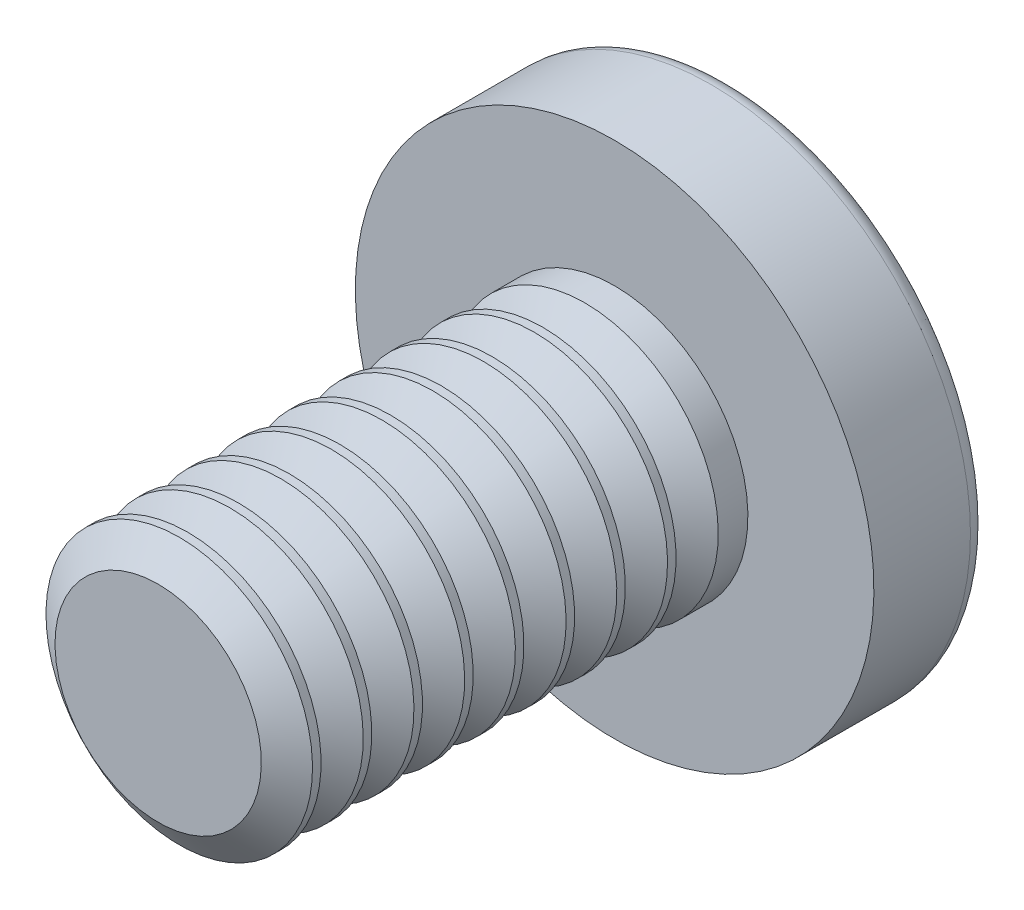
ISO-10303-21;
HEADER;
FILE_DESCRIPTION(('STEP AP214'),'2;1');
FILE_NAME('part.step','',(''),(''),'','','');
FILE_SCHEMA(('AUTOMOTIVE_DESIGN { 1 0 10303 214 1 1 1 1 }'));
ENDSEC;
DATA;
#1=APPLICATION_CONTEXT('core data for automotive mechanical design processes');
#2=APPLICATION_PROTOCOL_DEFINITION('international standard','automotive_design',2000,#1);
#3=PRODUCT_CONTEXT('',#1,'mechanical');
#4=PRODUCT('Part','Part','',(#3));
#5=PRODUCT_RELATED_PRODUCT_CATEGORY('part','',(#4));
#6=PRODUCT_DEFINITION_FORMATION('','',#4);
#7=PRODUCT_DEFINITION_CONTEXT('part definition',#1,'design');
#8=PRODUCT_DEFINITION('design','',#6,#7);
#9=PRODUCT_DEFINITION_SHAPE('','',#8);
#10=(LENGTH_UNIT() NAMED_UNIT(*) SI_UNIT(.MILLI.,.METRE.));
#11=(NAMED_UNIT(*) PLANE_ANGLE_UNIT() SI_UNIT($,.RADIAN.));
#12=(NAMED_UNIT(*) SI_UNIT($,.STERADIAN.) SOLID_ANGLE_UNIT());
#13=UNCERTAINTY_MEASURE_WITH_UNIT(LENGTH_MEASURE(1.E-05),#10,'distance_accuracy_value','');
#14=(GEOMETRIC_REPRESENTATION_CONTEXT(3) GLOBAL_UNCERTAINTY_ASSIGNED_CONTEXT((#13)) GLOBAL_UNIT_ASSIGNED_CONTEXT((#10,
#11,#12)) REPRESENTATION_CONTEXT('',''));
#15=CARTESIAN_POINT('',(0.,0.,0.));
#16=DIRECTION('',(0.,0.,1.));
#17=DIRECTION('',(1.,0.,0.));
#18=AXIS2_PLACEMENT_3D('',#15,#16,#17);
#19=CARTESIAN_POINT('',(-24.5432148881919,23.9214664243212,-2.10712260314341));
#20=DIRECTION('',(0.,0.,1.));
#21=DIRECTION('',(0.,-1.,0.));
#22=AXIS2_PLACEMENT_3D('',#19,#20,#21);
#23=PLANE('',#22);
#24=CARTESIAN_POINT('',(-24.5432148881919,22.9943664243215,-2.10712260314409));
#25=DIRECTION('',(0.,0.,-1.));
#26=DIRECTION('',(0.,1.,0.));
#27=AXIS2_PLACEMENT_3D('',#24,#25,#26);
#28=CIRCLE('',#27,0.717549999990293);
#29=CARTESIAN_POINT('',(-24.5432148881919,23.7119164243117,-2.10712260314409));
#30=VERTEX_POINT('',#29);
#31=EDGE_CURVE('E20',#30,#30,#28,.T.);
#32=ORIENTED_EDGE('',*,*,#31,.F.);
#33=EDGE_LOOP('',(#32));
#34=FACE_BOUND('',#33,.T.);
#35=ADVANCED_FACE('F17',(#34),#23,.T.);
#36=CARTESIAN_POINT('',(-24.5432148881919,22.9943664243215,-2.25385109274612));
#37=DIRECTION('',(0.,0.,-1.));
#38=DIRECTION('',(0.,1.,0.));
#39=AXIS2_PLACEMENT_3D('',#36,#37,#38);
#40=CONICAL_SURFACE('',#39,0.927099999906644,0.959931088504795);
#41=CARTESIAN_POINT('',(-24.5432148881919,22.9943664243214,-2.25385109277525));
#42=DIRECTION('',(0.,0.,-1.));
#43=DIRECTION('',(0.,1.,0.));
#44=AXIS2_PLACEMENT_3D('',#41,#42,#43);
#45=CIRCLE('',#44,0.9271);
#46=CARTESIAN_POINT('',(-24.5432148881919,23.9214664243214,-2.25385109277525));
#47=VERTEX_POINT('',#46);
#48=EDGE_CURVE('E197',#47,#47,#45,.T.);
#49=ORIENTED_EDGE('',*,*,#48,.F.);
#50=EDGE_LOOP('',(#49));
#51=FACE_BOUND('',#50,.T.);
#52=ORIENTED_EDGE('',*,*,#31,.T.);
#53=EDGE_LOOP('',(#52));
#54=FACE_BOUND('',#53,.T.);
#55=ADVANCED_FACE('F710',(#51,#54),#40,.T.);
#56=CARTESIAN_POINT('',(-24.5432148881919,22.9943664243214,-32.0283226031433));
#57=DIRECTION('',(0.,0.,-1.));
#58=DIRECTION('',(0.,1.,0.));
#59=AXIS2_PLACEMENT_3D('',#56,#57,#58);
#60=CYLINDRICAL_SURFACE('',#59,0.9271);
#61=CARTESIAN_POINT('',(-24.543214888192,22.9943664243215,-2.31313661350896));
#62=DIRECTION('',(0.,0.,1.));
#63=DIRECTION('',(0.,1.,0.));
#64=AXIS2_PLACEMENT_3D('',#61,#62,#63);
#65=CIRCLE('',#64,0.927099999948059);
#66=CARTESIAN_POINT('',(-24.543214888192,23.9214664242695,-2.31313661350896));
#67=VERTEX_POINT('',#66);
#68=EDGE_CURVE('E194',#67,#67,#65,.F.);
#69=ORIENTED_EDGE('',*,*,#68,.F.);
#70=EDGE_LOOP('',(#69));
#71=FACE_BOUND('',#70,.T.);
#72=ORIENTED_EDGE('',*,*,#48,.T.);
#73=EDGE_LOOP('',(#72));
#74=FACE_BOUND('',#73,.T.);
#75=ADVANCED_FACE('F700',(#71,#74),#60,.T.);
#76=CARTESIAN_POINT('',(-24.543214888192,22.9943664243214,-2.31313661350896));
#77=DIRECTION('',(0.,0.,1.));
#78=DIRECTION('',(0.,-1.,0.));
#79=AXIS2_PLACEMENT_3D('',#76,#77,#78);
#80=CONICAL_SURFACE('',#79,0.927099999948062,0.959931088632246);
#81=CARTESIAN_POINT('',(-24.543214888192,22.9943664243215,-2.45986510316243));
#82=DIRECTION('',(0.,0.,-1.));
#83=DIRECTION('',(0.,-1.,0.));
#84=AXIS2_PLACEMENT_3D('',#81,#82,#83);
#85=CIRCLE('',#84,0.717549999998009);
#86=CARTESIAN_POINT('',(-24.543214888192,22.2768164243234,-2.45986510316243));
#87=VERTEX_POINT('',#86);
#88=EDGE_CURVE('E191',#87,#87,#85,.T.);
#89=ORIENTED_EDGE('',*,*,#88,.F.);
#90=EDGE_LOOP('',(#89));
#91=FACE_BOUND('',#90,.T.);
#92=ORIENTED_EDGE('',*,*,#68,.T.);
#93=EDGE_LOOP('',(#92));
#94=FACE_BOUND('',#93,.T.);
#95=ADVANCED_FACE('F690',(#91,#94),#80,.T.);
#96=CARTESIAN_POINT('',(-24.543214888192,22.9943664243215,-2.60659359275905));
#97=DIRECTION('',(0.,0.,-1.));
#98=DIRECTION('',(0.,1.,0.));
#99=AXIS2_PLACEMENT_3D('',#96,#97,#98);
#100=CONICAL_SURFACE('',#99,0.927099999906644,0.959931088504795);
#101=ORIENTED_EDGE('',*,*,#88,.T.);
#102=EDGE_LOOP('',(#101));
#103=FACE_BOUND('',#102,.T.);
#104=CARTESIAN_POINT('',(-24.5432148881919,22.9943664243214,-2.60659359277526));
#105=DIRECTION('',(0.,0.,-1.));
#106=DIRECTION('',(0.,1.,0.));
#107=AXIS2_PLACEMENT_3D('',#104,#105,#106);
#108=CIRCLE('',#107,0.9271);
#109=CARTESIAN_POINT('',(-24.5432148881919,23.9214664243214,-2.60659359277526));
#110=VERTEX_POINT('',#109);
#111=EDGE_CURVE('E188',#110,#110,#108,.T.);
#112=ORIENTED_EDGE('',*,*,#111,.F.);
#113=EDGE_LOOP('',(#112));
#114=FACE_BOUND('',#113,.T.);
#115=ADVANCED_FACE('F680',(#103,#114),#100,.T.);
#116=CARTESIAN_POINT('',(-24.5432148881919,22.9943664243214,-32.0283226031433));
#117=DIRECTION('',(0.,0.,-1.));
#118=DIRECTION('',(0.,1.,0.));
#119=AXIS2_PLACEMENT_3D('',#116,#117,#118);
#120=CYLINDRICAL_SURFACE('',#119,0.9271);
#121=ORIENTED_EDGE('',*,*,#111,.T.);
#122=EDGE_LOOP('',(#121));
#123=FACE_BOUND('',#122,.T.);
#124=CARTESIAN_POINT('',(-24.5432148881919,22.9943664243214,-2.6658791135219));
#125=DIRECTION('',(0.,0.,1.));
#126=DIRECTION('',(0.,1.,0.));
#127=AXIS2_PLACEMENT_3D('',#124,#125,#126);
#128=CIRCLE('',#127,0.927099999948111);
#129=CARTESIAN_POINT('',(-24.5432148881919,23.9214664242695,-2.6658791135219));
#130=VERTEX_POINT('',#129);
#131=EDGE_CURVE('E185',#130,#130,#128,.F.);
#132=ORIENTED_EDGE('',*,*,#131,.F.);
#133=EDGE_LOOP('',(#132));
#134=FACE_BOUND('',#133,.T.);
#135=ADVANCED_FACE('F670',(#123,#134),#120,.T.);
#136=CARTESIAN_POINT('',(-24.5432148881919,22.9943664243214,-2.6658791135219));
#137=DIRECTION('',(0.,0.,1.));
#138=DIRECTION('',(0.,-1.,0.));
#139=AXIS2_PLACEMENT_3D('',#136,#137,#138);
#140=CONICAL_SURFACE('',#139,0.927099999948111,0.959931088632246);
#141=ORIENTED_EDGE('',*,*,#131,.T.);
#142=EDGE_LOOP('',(#141));
#143=FACE_BOUND('',#142,.T.);
#144=CARTESIAN_POINT('',(-24.5432148881919,22.9943664243214,-2.81260760311852));
#145=DIRECTION('',(0.,0.,-1.));
#146=DIRECTION('',(0.,-1.,0.));
#147=AXIS2_PLACEMENT_3D('',#144,#145,#146);
#148=CIRCLE('',#147,0.717549999997957);
#149=CARTESIAN_POINT('',(-24.5432148881919,22.2768164243234,-2.81260760311852));
#150=VERTEX_POINT('',#149);
#151=EDGE_CURVE('E182',#150,#150,#148,.T.);
#152=ORIENTED_EDGE('',*,*,#151,.F.);
#153=EDGE_LOOP('',(#152));
#154=FACE_BOUND('',#153,.T.);
#155=ADVANCED_FACE('F660',(#143,#154),#140,.T.);
#156=CARTESIAN_POINT('',(-24.5432148881919,22.9943664243214,-2.95933609271515));
#157=DIRECTION('',(0.,0.,-1.));
#158=DIRECTION('',(0.,1.,0.));
#159=AXIS2_PLACEMENT_3D('',#156,#157,#158);
#160=CONICAL_SURFACE('',#159,0.927099999906589,0.959931088504793);
#161=CARTESIAN_POINT('',(-24.5432148881919,22.9943664243214,-2.95933609277526));
#162=DIRECTION('',(0.,0.,-1.));
#163=DIRECTION('',(0.,1.,0.));
#164=AXIS2_PLACEMENT_3D('',#161,#162,#163);
#165=CIRCLE('',#164,0.9271);
#166=CARTESIAN_POINT('',(-24.5432148881919,23.9214664243214,-2.95933609277526));
#167=VERTEX_POINT('',#166);
#168=EDGE_CURVE('E179',#167,#167,#165,.T.);
#169=ORIENTED_EDGE('',*,*,#168,.F.);
#170=EDGE_LOOP('',(#169));
#171=FACE_BOUND('',#170,.T.);
#172=ORIENTED_EDGE('',*,*,#151,.T.);
#173=EDGE_LOOP('',(#172));
#174=FACE_BOUND('',#173,.T.);
#175=ADVANCED_FACE('F650',(#171,#174),#160,.T.);
#176=CARTESIAN_POINT('',(-24.5432148881919,22.9943664243214,-32.0283226031433));
#177=DIRECTION('',(0.,0.,-1.));
#178=DIRECTION('',(0.,1.,0.));
#179=AXIS2_PLACEMENT_3D('',#176,#177,#178);
#180=CYLINDRICAL_SURFACE('',#179,0.9271);
#181=CARTESIAN_POINT('',(-24.543214888192,22.9943664243215,-3.01862161353483));
#182=DIRECTION('',(0.,0.,1.));
#183=DIRECTION('',(0.,1.,0.));
#184=AXIS2_PLACEMENT_3D('',#181,#182,#183);
#185=CIRCLE('',#184,0.927099999948059);
#186=CARTESIAN_POINT('',(-24.543214888192,23.9214664242695,-3.01862161353483));
#187=VERTEX_POINT('',#186);
#188=EDGE_CURVE('E176',#187,#187,#185,.F.);
#189=ORIENTED_EDGE('',*,*,#188,.F.);
#190=EDGE_LOOP('',(#189));
#191=FACE_BOUND('',#190,.T.);
#192=ORIENTED_EDGE('',*,*,#168,.T.);
#193=EDGE_LOOP('',(#192));
#194=FACE_BOUND('',#193,.T.);
#195=ADVANCED_FACE('F640',(#191,#194),#180,.T.);
#196=CARTESIAN_POINT('',(-24.543214888192,22.9943664243215,-3.01862161353483));
#197=DIRECTION('',(0.,0.,1.));
#198=DIRECTION('',(0.,-1.,0.));
#199=AXIS2_PLACEMENT_3D('',#196,#197,#198);
#200=CONICAL_SURFACE('',#199,0.927099999948059,0.959931088632246);
#201=CARTESIAN_POINT('',(-24.5432148881919,22.9943664243214,-3.16535010313146));
#202=DIRECTION('',(0.,0.,-1.));
#203=DIRECTION('',(0.,-1.,0.));
#204=AXIS2_PLACEMENT_3D('',#201,#202,#203);
#205=CIRCLE('',#204,0.717549999997957);
#206=CARTESIAN_POINT('',(-24.5432148881919,22.2768164243234,-3.16535010313146));
#207=VERTEX_POINT('',#206);
#208=EDGE_CURVE('E173',#207,#207,#205,.T.);
#209=ORIENTED_EDGE('',*,*,#208,.F.);
#210=EDGE_LOOP('',(#209));
#211=FACE_BOUND('',#210,.T.);
#212=ORIENTED_EDGE('',*,*,#188,.T.);
#213=EDGE_LOOP('',(#212));
#214=FACE_BOUND('',#213,.T.);
#215=ADVANCED_FACE('F630',(#211,#214),#200,.T.);
#216=CARTESIAN_POINT('',(-24.5432148881919,22.9943664243214,-3.31207859272808));
#217=DIRECTION('',(0.,0.,-1.));
#218=DIRECTION('',(0.,1.,0.));
#219=AXIS2_PLACEMENT_3D('',#216,#217,#218);
#220=CONICAL_SURFACE('',#219,0.927099999906589,0.959931088504793);
#221=ORIENTED_EDGE('',*,*,#208,.T.);
#222=EDGE_LOOP('',(#221));
#223=FACE_BOUND('',#222,.T.);
#224=CARTESIAN_POINT('',(-24.5432148881919,22.9943664243214,-3.31207859277526));
#225=DIRECTION('',(0.,0.,-1.));
#226=DIRECTION('',(0.,1.,0.));
#227=AXIS2_PLACEMENT_3D('',#224,#225,#226);
#228=CIRCLE('',#227,0.9271);
#229=CARTESIAN_POINT('',(-24.5432148881919,23.9214664243214,-3.31207859277525));
#230=VERTEX_POINT('',#229);
#231=EDGE_CURVE('E170',#230,#230,#228,.T.);
#232=ORIENTED_EDGE('',*,*,#231,.F.);
#233=EDGE_LOOP('',(#232));
#234=FACE_BOUND('',#233,.T.);
#235=ADVANCED_FACE('F620',(#223,#234),#220,.T.);
#236=CARTESIAN_POINT('',(-24.5432148881919,22.9943664243214,-32.0283226031433));
#237=DIRECTION('',(0.,0.,-1.));
#238=DIRECTION('',(0.,1.,0.));
#239=AXIS2_PLACEMENT_3D('',#236,#237,#238);
#240=CYLINDRICAL_SURFACE('',#239,0.9271);
#241=ORIENTED_EDGE('',*,*,#231,.T.);
#242=EDGE_LOOP('',(#241));
#243=FACE_BOUND('',#242,.T.);
#244=CARTESIAN_POINT('',(-24.5432148881919,22.9943664243214,-3.37136411343408));
#245=DIRECTION('',(0.,0.,1.));
#246=DIRECTION('',(0.,1.,0.));
#247=AXIS2_PLACEMENT_3D('',#244,#245,#246);
#248=CIRCLE('',#247,0.927100000004955);
#249=CARTESIAN_POINT('',(-24.5432148881919,23.9214664243264,-3.37136411343408));
#250=VERTEX_POINT('',#249);
#251=EDGE_CURVE('E167',#250,#250,#248,.F.);
#252=ORIENTED_EDGE('',*,*,#251,.F.);
#253=EDGE_LOOP('',(#252));
#254=FACE_BOUND('',#253,.T.);
#255=ADVANCED_FACE('F610',(#243,#254),#240,.T.);
#256=CARTESIAN_POINT('',(-24.5432148881919,22.9943664243214,-3.37136411343408));
#257=DIRECTION('',(0.,0.,1.));
#258=DIRECTION('',(0.,-1.,0.));
#259=AXIS2_PLACEMENT_3D('',#256,#257,#258);
#260=CONICAL_SURFACE('',#259,0.927100000004955,0.959931088650563);
#261=ORIENTED_EDGE('',*,*,#251,.T.);
#262=EDGE_LOOP('',(#261));
#263=FACE_BOUND('',#262,.T.);
#264=CARTESIAN_POINT('',(-24.543214888192,22.9943664243215,-3.5180926031444));
#265=DIRECTION('',(0.,0.,-1.));
#266=DIRECTION('',(0.,-1.,0.));
#267=AXIS2_PLACEMENT_3D('',#264,#265,#266);
#268=CIRCLE('',#267,0.717549999998009);
#269=CARTESIAN_POINT('',(-24.543214888192,22.2768164243234,-3.5180926031444));
#270=VERTEX_POINT('',#269);
#271=EDGE_CURVE('E164',#270,#270,#268,.T.);
#272=ORIENTED_EDGE('',*,*,#271,.F.);
#273=EDGE_LOOP('',(#272));
#274=FACE_BOUND('',#273,.T.);
#275=ADVANCED_FACE('F600',(#263,#274),#260,.T.);
#276=CARTESIAN_POINT('',(-24.543214888192,22.9943664243214,-3.66482109274102));
#277=DIRECTION('',(0.,0.,-1.));
#278=DIRECTION('',(0.,1.,0.));
#279=AXIS2_PLACEMENT_3D('',#276,#277,#278);
#280=CONICAL_SURFACE('',#279,0.927099999906637,0.959931088504795);
#281=CARTESIAN_POINT('',(-24.5432148881919,22.9943664243214,-3.66482109277525));
#282=DIRECTION('',(0.,0.,-1.));
#283=DIRECTION('',(0.,1.,0.));
#284=AXIS2_PLACEMENT_3D('',#281,#282,#283);
#285=CIRCLE('',#284,0.9271);
#286=CARTESIAN_POINT('',(-24.5432148881919,23.9214664243214,-3.66482109277525));
#287=VERTEX_POINT('',#286);
#288=EDGE_CURVE('E161',#287,#287,#285,.T.);
#289=ORIENTED_EDGE('',*,*,#288,.F.);
#290=EDGE_LOOP('',(#289));
#291=FACE_BOUND('',#290,.T.);
#292=ORIENTED_EDGE('',*,*,#271,.T.);
#293=EDGE_LOOP('',(#292));
#294=FACE_BOUND('',#293,.T.);
#295=ADVANCED_FACE('F590',(#291,#294),#280,.T.);
#296=CARTESIAN_POINT('',(-24.5432148881919,22.9943664243214,-32.0283226031433));
#297=DIRECTION('',(0.,0.,-1.));
#298=DIRECTION('',(0.,1.,0.));
#299=AXIS2_PLACEMENT_3D('',#296,#297,#298);
#300=CYLINDRICAL_SURFACE('',#299,0.9271);
#301=CARTESIAN_POINT('',(-24.543214888192,22.9943664243215,-3.72410661350386));
#302=DIRECTION('',(0.,0.,1.));
#303=DIRECTION('',(0.,1.,0.));
#304=AXIS2_PLACEMENT_3D('',#301,#302,#303);
#305=CIRCLE('',#304,0.927099999948059);
#306=CARTESIAN_POINT('',(-24.543214888192,23.9214664242695,-3.72410661350386));
#307=VERTEX_POINT('',#306);
#308=EDGE_CURVE('E158',#307,#307,#305,.F.);
#309=ORIENTED_EDGE('',*,*,#308,.F.);
#310=EDGE_LOOP('',(#309));
#311=FACE_BOUND('',#310,.T.);
#312=ORIENTED_EDGE('',*,*,#288,.T.);
#313=EDGE_LOOP('',(#312));
#314=FACE_BOUND('',#313,.T.);
#315=ADVANCED_FACE('F580',(#311,#314),#300,.T.);
#316=CARTESIAN_POINT('',(-24.543214888192,22.9943664243215,-3.72410661350386));
#317=DIRECTION('',(0.,0.,1.));
#318=DIRECTION('',(0.,-1.,0.));
#319=AXIS2_PLACEMENT_3D('',#316,#317,#318);
#320=CONICAL_SURFACE('',#319,0.927099999948059,0.959931088632247);
#321=CARTESIAN_POINT('',(-24.543214888192,22.9943664243215,-3.87083510315733));
#322=DIRECTION('',(0.,0.,-1.));
#323=DIRECTION('',(0.,-1.,0.));
#324=AXIS2_PLACEMENT_3D('',#321,#322,#323);
#325=CIRCLE('',#324,0.717549999998009);
#326=CARTESIAN_POINT('',(-24.543214888192,22.2768164243234,-3.87083510315733));
#327=VERTEX_POINT('',#326);
#328=EDGE_CURVE('E155',#327,#327,#325,.T.);
#329=ORIENTED_EDGE('',*,*,#328,.F.);
#330=EDGE_LOOP('',(#329));
#331=FACE_BOUND('',#330,.T.);
#332=ORIENTED_EDGE('',*,*,#308,.T.);
#333=EDGE_LOOP('',(#332));
#334=FACE_BOUND('',#333,.T.);
#335=ADVANCED_FACE('F570',(#331,#334),#320,.T.);
#336=CARTESIAN_POINT('',(-24.543214888192,22.9943664243214,-4.01756359275396));
#337=DIRECTION('',(0.,0.,-1.));
#338=DIRECTION('',(0.,1.,0.));
#339=AXIS2_PLACEMENT_3D('',#336,#337,#338);
#340=CONICAL_SURFACE('',#339,0.927099999906637,0.959931088504793);
#341=ORIENTED_EDGE('',*,*,#328,.T.);
#342=EDGE_LOOP('',(#341));
#343=FACE_BOUND('',#342,.T.);
#344=CARTESIAN_POINT('',(-24.5432148881919,22.9943664243214,-4.01756359277525));
#345=DIRECTION('',(0.,0.,-1.));
#346=DIRECTION('',(0.,1.,0.));
#347=AXIS2_PLACEMENT_3D('',#344,#345,#346);
#348=CIRCLE('',#347,0.9271);
#349=CARTESIAN_POINT('',(-24.5432148881919,23.9214664243214,-4.01756359277525));
#350=VERTEX_POINT('',#349);
#351=EDGE_CURVE('E152',#350,#350,#348,.T.);
#352=ORIENTED_EDGE('',*,*,#351,.F.);
#353=EDGE_LOOP('',(#352));
#354=FACE_BOUND('',#353,.T.);
#355=ADVANCED_FACE('F560',(#343,#354),#340,.T.);
#356=CARTESIAN_POINT('',(-24.5432148881919,22.9943664243214,-32.0283226031433));
#357=DIRECTION('',(0.,0.,-1.));
#358=DIRECTION('',(0.,1.,0.));
#359=AXIS2_PLACEMENT_3D('',#356,#357,#358);
#360=CYLINDRICAL_SURFACE('',#359,0.9271);
#361=ORIENTED_EDGE('',*,*,#351,.T.);
#362=EDGE_LOOP('',(#361));
#363=FACE_BOUND('',#362,.T.);
#364=CARTESIAN_POINT('',(-24.543214888192,22.9943664243215,-4.07684911345996));
#365=DIRECTION('',(0.,0.,1.));
#366=DIRECTION('',(0.,1.,0.));
#367=AXIS2_PLACEMENT_3D('',#364,#365,#366);
#368=CIRCLE('',#367,0.927100000004902);
#369=CARTESIAN_POINT('',(-24.543214888192,23.9214664243264,-4.07684911345996));
#370=VERTEX_POINT('',#369);
#371=EDGE_CURVE('E149',#370,#370,#368,.F.);
#372=ORIENTED_EDGE('',*,*,#371,.F.);
#373=EDGE_LOOP('',(#372));
#374=FACE_BOUND('',#373,.T.);
#375=ADVANCED_FACE('F550',(#363,#374),#360,.T.);
#376=CARTESIAN_POINT('',(-24.543214888192,22.9943664243215,-4.07684911345996));
#377=DIRECTION('',(0.,0.,1.));
#378=DIRECTION('',(0.,-1.,0.));
#379=AXIS2_PLACEMENT_3D('',#376,#377,#378);
#380=CONICAL_SURFACE('',#379,0.927100000004902,0.959931088650561);
#381=ORIENTED_EDGE('',*,*,#371,.T.);
#382=EDGE_LOOP('',(#381));
#383=FACE_BOUND('',#382,.T.);
#384=CARTESIAN_POINT('',(-24.5432148881919,22.9943664243214,-4.22357760317027));
#385=DIRECTION('',(0.,0.,-1.));
#386=DIRECTION('',(0.,-1.,0.));
#387=AXIS2_PLACEMENT_3D('',#384,#385,#386);
#388=CIRCLE('',#387,0.717549999997957);
#389=CARTESIAN_POINT('',(-24.5432148881919,22.2768164243234,-4.22357760317027));
#390=VERTEX_POINT('',#389);
#391=EDGE_CURVE('E146',#390,#390,#388,.T.);
#392=ORIENTED_EDGE('',*,*,#391,.F.);
#393=EDGE_LOOP('',(#392));
#394=FACE_BOUND('',#393,.T.);
#395=ADVANCED_FACE('F540',(#383,#394),#380,.T.);
#396=CARTESIAN_POINT('',(-24.5432148881919,22.9943664243214,-4.37030609271005));
#397=DIRECTION('',(0.,0.,-1.));
#398=DIRECTION('',(0.,1.,0.));
#399=AXIS2_PLACEMENT_3D('',#396,#397,#398);
#400=CONICAL_SURFACE('',#399,0.927099999792902,0.959931088523111);
#401=CARTESIAN_POINT('',(-24.5432148881919,22.9943664243214,-4.37030609277525));
#402=DIRECTION('',(0.,0.,-1.));
#403=DIRECTION('',(0.,1.,0.));
#404=AXIS2_PLACEMENT_3D('',#401,#402,#403);
#405=CIRCLE('',#404,0.9271);
#406=CARTESIAN_POINT('',(-24.5432148881919,23.9214664243214,-4.37030609277525));
#407=VERTEX_POINT('',#406);
#408=EDGE_CURVE('E139',#407,#407,#405,.T.);
#409=ORIENTED_EDGE('',*,*,#408,.F.);
#410=EDGE_LOOP('',(#409));
#411=FACE_BOUND('',#410,.T.);
#412=ORIENTED_EDGE('',*,*,#391,.T.);
#413=EDGE_LOOP('',(#412));
#414=FACE_BOUND('',#413,.T.);
#415=ADVANCED_FACE('F530',(#411,#414),#400,.T.);
#416=CARTESIAN_POINT('',(-24.5432148881919,22.9943664243214,-32.0283226031433));
#417=DIRECTION('',(0.,0.,-1.));
#418=DIRECTION('',(0.,1.,0.));
#419=AXIS2_PLACEMENT_3D('',#416,#417,#418);
#420=CYLINDRICAL_SURFACE('',#419,0.9271);
#421=CARTESIAN_POINT('',(-24.5432148881919,22.9943664243214,-4.42959161347289));
#422=DIRECTION('',(0.,0.,1.));
#423=DIRECTION('',(0.,1.,0.));
#424=AXIS2_PLACEMENT_3D('',#421,#422,#423);
#425=CIRCLE('',#424,0.927100000004955);
#426=CARTESIAN_POINT('',(-24.5432148881919,23.9214664243264,-4.42959161347289));
#427=VERTEX_POINT('',#426);
#428=EDGE_CURVE('E136',#427,#427,#425,.F.);
#429=ORIENTED_EDGE('',*,*,#428,.F.);
#430=EDGE_LOOP('',(#429));
#431=FACE_BOUND('',#430,.T.);
#432=ORIENTED_EDGE('',*,*,#408,.T.);
#433=EDGE_LOOP('',(#432));
#434=FACE_BOUND('',#433,.T.);
#435=ADVANCED_FACE('F307',(#431,#434),#420,.T.);
#436=CARTESIAN_POINT('',(-24.5432148881919,22.9943664243214,-4.42959161347289));
#437=DIRECTION('',(0.,0.,1.));
#438=DIRECTION('',(0.,-1.,0.));
#439=AXIS2_PLACEMENT_3D('',#436,#437,#438);
#440=CONICAL_SURFACE('',#439,0.927100000004955,0.959931088650561);
#441=CARTESIAN_POINT('',(-24.543214888192,22.9943664243215,-4.57632010312636));
#442=DIRECTION('',(0.,0.,-1.));
#443=DIRECTION('',(0.,-1.,0.));
#444=AXIS2_PLACEMENT_3D('',#441,#442,#443);
#445=CIRCLE('',#444,0.717549999998009);
#446=CARTESIAN_POINT('',(-24.543214888192,22.2768164243234,-4.57632010312636));
#447=VERTEX_POINT('',#446);
#448=EDGE_CURVE('E133',#447,#447,#445,.T.);
#449=ORIENTED_EDGE('',*,*,#448,.F.);
#450=EDGE_LOOP('',(#449));
#451=FACE_BOUND('',#450,.T.);
#452=ORIENTED_EDGE('',*,*,#428,.T.);
#453=EDGE_LOOP('',(#452));
#454=FACE_BOUND('',#453,.T.);
#455=ADVANCED_FACE('F298',(#451,#454),#440,.T.);
#456=CARTESIAN_POINT('',(-24.543214888192,22.9943664243215,-4.72304859266614));
#457=DIRECTION('',(0.,0.,-1.));
#458=DIRECTION('',(0.,1.,0.));
#459=AXIS2_PLACEMENT_3D('',#456,#457,#458);
#460=CONICAL_SURFACE('',#459,0.927099999792957,0.959931088523109);
#461=ORIENTED_EDGE('',*,*,#448,.T.);
#462=EDGE_LOOP('',(#461));
#463=FACE_BOUND('',#462,.T.);
#464=CARTESIAN_POINT('',(-24.5432148881919,22.9943664243214,-4.72304859277526));
#465=DIRECTION('',(0.,0.,-1.));
#466=DIRECTION('',(0.,1.,0.));
#467=AXIS2_PLACEMENT_3D('',#464,#465,#466);
#468=CIRCLE('',#467,0.9271);
#469=CARTESIAN_POINT('',(-24.5432148881919,23.9214664243214,-4.72304859277526));
#470=VERTEX_POINT('',#469);
#471=EDGE_CURVE('E104',#470,#470,#468,.T.);
#472=ORIENTED_EDGE('',*,*,#471,.F.);
#473=EDGE_LOOP('',(#472));
#474=FACE_BOUND('',#473,.T.);
#475=ADVANCED_FACE('F296',(#463,#474),#460,.T.);
#476=CARTESIAN_POINT('',(-24.390814888192,23.1467664243214,-5.45992260314341));
#477=DIRECTION('',(0.,0.,-1.));
#478=DIRECTION('',(0.,1.,0.));
#479=AXIS2_PLACEMENT_3D('',#476,#477,#478);
#480=PLANE('',#479);
#481=DIRECTION('',(0.,1.,0.));
#482=VECTOR('',#481,1.);
#483=CARTESIAN_POINT('',(-24.695614888192,22.8419664243214,-5.45992260314341));
#484=LINE('',#483,#482);
#485=CARTESIAN_POINT('',(-24.695614888192,22.8419664243214,-5.45992260314341));
#486=VERTEX_POINT('',#485);
#487=CARTESIAN_POINT('',(-24.695614888192,23.1467664243215,-5.45992260314341));
#488=VERTEX_POINT('',#487);
#489=EDGE_CURVE('E81',#486,#488,#484,.T.);
#490=ORIENTED_EDGE('',*,*,#489,.T.);
#491=DIRECTION('',(1.,0.,0.));
#492=VECTOR('',#491,1.);
#493=CARTESIAN_POINT('',(-24.695614888192,23.1467664243215,-5.45992260314341));
#494=LINE('',#493,#492);
#495=CARTESIAN_POINT('',(-24.3908148881919,23.1467664243214,-5.45992260314341));
#496=VERTEX_POINT('',#495);
#497=EDGE_CURVE('E125',#488,#496,#494,.T.);
#498=ORIENTED_EDGE('',*,*,#497,.T.);
#499=DIRECTION('',(0.,1.,0.));
#500=VECTOR('',#499,1.);
#501=CARTESIAN_POINT('',(-24.390814888192,23.1467664243214,-5.45992260314341));
#502=LINE('',#501,#500);
#503=CARTESIAN_POINT('',(-24.3908148881919,22.8419664243214,-5.45992260314341));
#504=VERTEX_POINT('',#503);
#505=EDGE_CURVE('E91',#496,#504,#502,.F.);
#506=ORIENTED_EDGE('',*,*,#505,.T.);
#507=DIRECTION('',(1.,0.,0.));
#508=VECTOR('',#507,1.);
#509=CARTESIAN_POINT('',(-24.3908148881919,22.8419664243214,-5.45992260314341));
#510=LINE('',#509,#508);
#511=EDGE_CURVE('E110',#504,#486,#510,.F.);
#512=ORIENTED_EDGE('',*,*,#511,.T.);
#513=EDGE_LOOP('',(#490,#498,#506,#512));
#514=FACE_BOUND('',#513,.T.);
#515=ADVANCED_FACE('F124',(#514),#480,.T.);
#516=CARTESIAN_POINT('',(-24.5432148881919,22.9943664243214,-32.0283226031433));
#517=DIRECTION('',(0.,0.,-1.));
#518=DIRECTION('',(0.,1.,0.));
#519=AXIS2_PLACEMENT_3D('',#516,#517,#518);
#520=CYLINDRICAL_SURFACE('',#519,0.9271);
#521=ORIENTED_EDGE('',*,*,#471,.T.);
#522=EDGE_LOOP('',(#521));
#523=FACE_BOUND('',#522,.T.);
#524=CARTESIAN_POINT('',(-24.5432148881919,22.9943664243214,-4.78233411342899));
#525=DIRECTION('',(0.,0.,1.));
#526=DIRECTION('',(0.,1.,0.));
#527=AXIS2_PLACEMENT_3D('',#524,#525,#526);
#528=CIRCLE('',#527,0.927100000004955);
#529=CARTESIAN_POINT('',(-24.5432148881919,23.9214664243264,-4.78233411342899));
#530=VERTEX_POINT('',#529);
#531=EDGE_CURVE('E237',#530,#530,#528,.F.);
#532=ORIENTED_EDGE('',*,*,#531,.F.);
#533=EDGE_LOOP('',(#532));
#534=FACE_BOUND('',#533,.T.);
#535=ADVANCED_FACE('F293',(#523,#534),#520,.T.);
#536=CARTESIAN_POINT('',(-24.4145655375425,22.9943664243214,-5.2778342914551));
#537=DIRECTION('',(-0.991600411186222,0.,-0.129339184067769));
#538=DIRECTION('',(-0.129339184067769,0.,0.991600411186222));
#539=AXIS2_PLACEMENT_3D('',#536,#537,#538);
#540=PLANE('',#539);
#541=DIRECTION('',(-0.128270737442661,0.128270737442703,0.983408987060735));
#542=VECTOR('',#541,1.);
#543=CARTESIAN_POINT('',(-24.2424136528217,22.6935651889511,-6.59766540764871));
#544=LINE('',#543,#542);
#545=CARTESIAN_POINT('',(-24.2424136528216,22.6935651889511,-6.59766540764869));
#546=VERTEX_POINT('',#545);
#547=EDGE_CURVE('E97',#546,#504,#544,.T.);
#548=ORIENTED_EDGE('',*,*,#547,.F.);
#549=CARTESIAN_POINT('',(-24.2619510198437,22.0150899357536,-6.44787892714649));
#550=CARTESIAN_POINT('',(-24.256974871441,22.1252085415911,-6.48602939823407));
#551=CARTESIAN_POINT('',(-24.2528586833211,22.236807448943,-6.51758684048637));
#552=CARTESIAN_POINT('',(-24.2463462276471,22.4629658666755,-6.56751566732043));
#553=CARTESIAN_POINT('',(-24.2439499600929,22.5775253770561,-6.58588705190219));
#554=CARTESIAN_POINT('',(-24.2424136528216,22.693565188951,-6.59766540764867));
#555=B_SPLINE_CURVE_WITH_KNOTS('',3,(#549,#550,#551,#552,#553,#554),.UNSPECIFIED.,.F.,.F.,(4,2,
4),(0.,0.34814390931699,0.696287818633975),.UNSPECIFIED.);
#556=CARTESIAN_POINT('',(-24.2619510198437,22.0150899357536,-6.44787892714649));
#557=VERTEX_POINT('',#556);
#558=EDGE_CURVE('E68',#557,#546,#555,.T.);
#559=ORIENTED_EDGE('',*,*,#558,.F.);
#560=DIRECTION('',(-0.0995276731450305,0.638635902680991,0.763045494112358));
#561=VECTOR('',#560,1.);
#562=CARTESIAN_POINT('',(-24.2619510198438,22.0150899357536,-6.44787892714649));
#563=LINE('',#562,#561);
#564=EDGE_CURVE('E106',#557,#504,#563,.T.);
#565=ORIENTED_EDGE('',*,*,#564,.T.);
#566=EDGE_LOOP('',(#548,#559,#565));
#567=FACE_BOUND('',#566,.T.);
#568=ADVANCED_FACE('F108',(#567),#540,.T.);
#569=CARTESIAN_POINT('',(-24.543214888192,22.8657170736721,-5.2778342914551));
#570=DIRECTION('',(0.,0.991600411186222,-0.129339184067766));
#571=DIRECTION('',(0.,0.129339184067766,0.991600411186222));
#572=AXIS2_PLACEMENT_3D('',#569,#570,#571);
#573=PLANE('',#572);
#574=ORIENTED_EDGE('',*,*,#547,.T.);
#575=DIRECTION('',(0.63863590268099,-0.0995276731450726,-0.763045494112353));
#576=VECTOR('',#575,1.);
#577=CARTESIAN_POINT('',(-24.3908148881919,22.8419664243214,-5.45992260314344));
#578=LINE('',#577,#576);
#579=CARTESIAN_POINT('',(-23.5639383996242,22.7131025559732,-6.4478789271465));
#580=VERTEX_POINT('',#579);
#581=EDGE_CURVE('E100',#504,#580,#578,.T.);
#582=ORIENTED_EDGE('',*,*,#581,.T.);
#583=CARTESIAN_POINT('',(-24.2424136528217,22.6935651889512,-6.5976654076487));
#584=CARTESIAN_POINT('',(-24.1263738409267,22.6951014962224,-6.58588705190222));
#585=CARTESIAN_POINT('',(-24.0118143305461,22.6974977637766,-6.56751566732047));
#586=CARTESIAN_POINT('',(-23.7856559128136,22.7040102194506,-6.5175868404864));
#587=CARTESIAN_POINT('',(-23.6740570054617,22.7081264075705,-6.48602939823409));
#588=CARTESIAN_POINT('',(-23.5639383996242,22.7131025559732,-6.44787892714651));
#589=B_SPLINE_CURVE_WITH_KNOTS('',3,(#583,#584,#585,#586,#587,#588),.UNSPECIFIED.,.F.,.F.,(4,2,
4),(0.,0.348143909317069,0.696287818634133),.UNSPECIFIED.);
#590=EDGE_CURVE('E102',#546,#580,#589,.T.);
#591=ORIENTED_EDGE('',*,*,#590,.F.);
#592=EDGE_LOOP('',(#574,#582,#591));
#593=FACE_BOUND('',#592,.T.);
#594=ADVANCED_FACE('F99',(#593),#573,.T.);
#595=CARTESIAN_POINT('',(-24.390814888192,23.1467664243214,-5.45992260314341));
#596=DIRECTION('',(0.766853077224196,0.,0.641822684198511));
#597=DIRECTION('',(0.641822684198511,0.,-0.766853077224196));
#598=AXIS2_PLACEMENT_3D('',#595,#596,#597);
#599=PLANE('',#598);
#600=ORIENTED_EDGE('',*,*,#505,.F.);
#601=DIRECTION('',(-0.638635902680993,-0.0995276731450908,0.763045494112348));
#602=VECTOR('',#601,1.);
#603=CARTESIAN_POINT('',(-23.5639383996241,23.2756302926697,-6.44787892714648));
#604=LINE('',#603,#602);
#605=CARTESIAN_POINT('',(-23.5639383996241,23.2756302926697,-6.44787892714649));
#606=VERTEX_POINT('',#605);
#607=EDGE_CURVE('E121',#606,#496,#604,.T.);
#608=ORIENTED_EDGE('',*,*,#607,.F.);
#609=CARTESIAN_POINT('',(-23.5639383996241,22.7131025559732,-6.4478789271465));
#610=CARTESIAN_POINT('',(-23.5578335032805,22.8068571787559,-6.45517308901163));
#611=CARTESIAN_POINT('',(-23.5547810551087,22.9006118015387,-6.4588201699442));
#612=CARTESIAN_POINT('',(-23.5547810551087,23.0881210471042,-6.45882016994419));
#613=CARTESIAN_POINT('',(-23.5578335032805,23.1818756698869,-6.45517308901163));
#614=CARTESIAN_POINT('',(-23.5639383996241,23.2756302926697,-6.4478789271465));
#615=B_SPLINE_CURVE_WITH_KNOTS('',3,(#609,#610,#611,#612,#613,#614),.UNSPECIFIED.,.F.,.F.,(4,2,
4),(0.,0.281625516228106,0.56325103245621),.UNSPECIFIED.);
#616=EDGE_CURVE('E120',#580,#606,#615,.T.);
#617=ORIENTED_EDGE('',*,*,#616,.F.);
#618=ORIENTED_EDGE('',*,*,#581,.F.);
#619=EDGE_LOOP('',(#600,#608,#617,#618));
#620=FACE_BOUND('',#619,.T.);
#621=ADVANCED_FACE('F119',(#620),#599,.F.);
#622=CARTESIAN_POINT('',(-24.5432148881919,23.1230157749708,-5.2778342914551));
#623=DIRECTION('',(0.,-0.991600411186222,-0.129339184067769));
#624=DIRECTION('',(0.,0.129339184067769,-0.991600411186222));
#625=AXIS2_PLACEMENT_3D('',#622,#623,#624);
#626=PLANE('',#625);
#627=ORIENTED_EDGE('',*,*,#607,.T.);
#628=DIRECTION('',(-0.128270737442703,-0.128270737442739,0.983408987060725));
#629=VECTOR('',#628,1.);
#630=CARTESIAN_POINT('',(-24.2424136528216,23.2951676596916,-6.59766540764871));
#631=LINE('',#630,#629);
#632=CARTESIAN_POINT('',(-24.2424136528216,23.2951676596917,-6.5976654076487));
#633=VERTEX_POINT('',#632);
#634=EDGE_CURVE('E273',#633,#496,#631,.T.);
#635=ORIENTED_EDGE('',*,*,#634,.F.);
#636=CARTESIAN_POINT('',(-23.5639383996241,23.2756302926697,-6.4478789271465));
#637=CARTESIAN_POINT('',(-23.6740570054617,23.2806064410724,-6.48602939823408));
#638=CARTESIAN_POINT('',(-23.7856559128136,23.2847226291923,-6.51758684048639));
#639=CARTESIAN_POINT('',(-24.0118143305461,23.2912350848663,-6.56751566732045));
#640=CARTESIAN_POINT('',(-24.1263738409267,23.2936313524204,-6.58588705190221));
#641=CARTESIAN_POINT('',(-24.2424136528216,23.2951676596917,-6.59766540764869));
#642=B_SPLINE_CURVE_WITH_KNOTS('',3,(#636,#637,#638,#639,#640,#641),.UNSPECIFIED.,.F.,.F.,(4,2,
4),(0.,0.348143909317046,0.696287818634098),.UNSPECIFIED.);
#643=EDGE_CURVE('E373',#606,#633,#642,.T.);
#644=ORIENTED_EDGE('',*,*,#643,.F.);
#645=EDGE_LOOP('',(#627,#635,#644));
#646=FACE_BOUND('',#645,.T.);
#647=ADVANCED_FACE('F382',(#646),#626,.T.);
#648=CARTESIAN_POINT('',(-24.4145655375425,22.9943664243214,-5.2778342914551));
#649=DIRECTION('',(-0.991600411186222,0.,-0.129339184067769));
#650=DIRECTION('',(-0.129339184067769,0.,0.991600411186222));
#651=AXIS2_PLACEMENT_3D('',#648,#649,#650);
#652=PLANE('',#651);
#653=ORIENTED_EDGE('',*,*,#634,.T.);
#654=DIRECTION('',(0.0995276731450274,0.638635902680993,-0.763045494112356));
#655=VECTOR('',#654,1.);
#656=CARTESIAN_POINT('',(-24.390814888192,23.1467664243214,-5.45992260314336));
#657=LINE('',#656,#655);
#658=CARTESIAN_POINT('',(-24.2619510198437,23.9736429128892,-6.44787892714647));
#659=VERTEX_POINT('',#658);
#660=EDGE_CURVE('E266',#496,#659,#657,.T.);
#661=ORIENTED_EDGE('',*,*,#660,.T.);
#662=CARTESIAN_POINT('',(-24.2424136528216,23.2951676596917,-6.5976654076487));
#663=CARTESIAN_POINT('',(-24.2439499600929,23.4112074715866,-6.58588705190221));
#664=CARTESIAN_POINT('',(-24.2463462276471,23.5257669819672,-6.56751566732045));
#665=CARTESIAN_POINT('',(-24.2528586833211,23.7519253996997,-6.51758684048638));
#666=CARTESIAN_POINT('',(-24.2569748714409,23.8635243070517,-6.48602939823407));
#667=CARTESIAN_POINT('',(-24.2619510198437,23.9736429128892,-6.44787892714648));
#668=B_SPLINE_CURVE_WITH_KNOTS('',3,(#662,#663,#664,#665,#666,#667),.UNSPECIFIED.,.F.,.F.,(4,2,
4),(0.,0.348143909317081,0.696287818634161),.UNSPECIFIED.);
#669=EDGE_CURVE('E395',#633,#659,#668,.T.);
#670=ORIENTED_EDGE('',*,*,#669,.F.);
#671=EDGE_LOOP('',(#653,#661,#670));
#672=FACE_BOUND('',#671,.T.);
#673=ADVANCED_FACE('F386',(#672),#652,.T.);
#674=CARTESIAN_POINT('',(-24.695614888192,23.1467664243215,-5.45992260314341));
#675=DIRECTION('',(0.,0.766853077224196,0.641822684198511));
#676=DIRECTION('',(0.,-0.641822684198511,0.766853077224196));
#677=AXIS2_PLACEMENT_3D('',#674,#675,#676);
#678=PLANE('',#677);
#679=ORIENTED_EDGE('',*,*,#497,.F.);
#680=DIRECTION('',(0.0995276731450945,-0.638635902680917,0.763045494112411));
#681=VECTOR('',#680,1.);
#682=CARTESIAN_POINT('',(-24.8244787565402,23.9736429128891,-6.44787892714651));
#683=LINE('',#682,#681);
#684=CARTESIAN_POINT('',(-24.8244787565402,23.9736429128892,-6.44787892714649));
#685=VERTEX_POINT('',#684);
#686=EDGE_CURVE('E261',#685,#488,#683,.T.);
#687=ORIENTED_EDGE('',*,*,#686,.F.);
#688=CARTESIAN_POINT('',(-24.2619510198438,23.9736429128892,-6.44787892714649));
#689=CARTESIAN_POINT('',(-24.3557056426265,23.9797478092327,-6.45517308901138));
#690=CARTESIAN_POINT('',(-24.4494602654092,23.9828002574044,-6.45882016994382));
#691=CARTESIAN_POINT('',(-24.6369695109747,23.9828002574044,-6.45882016994382));
#692=CARTESIAN_POINT('',(-24.7307241337574,23.9797478092327,-6.45517308901137));
#693=CARTESIAN_POINT('',(-24.8244787565402,23.9736429128892,-6.44787892714647));
#694=B_SPLINE_CURVE_WITH_KNOTS('',3,(#688,#689,#690,#691,#692,#693),.UNSPECIFIED.,.F.,.F.,(4,2,
4),(0.,0.281625516227976,0.563251032456115),.UNSPECIFIED.);
#695=EDGE_CURVE('E402',#659,#685,#694,.T.);
#696=ORIENTED_EDGE('',*,*,#695,.F.);
#697=ORIENTED_EDGE('',*,*,#660,.F.);
#698=EDGE_LOOP('',(#679,#687,#696,#697));
#699=FACE_BOUND('',#698,.T.);
#700=ADVANCED_FACE('F391',(#699),#678,.F.);
#701=CARTESIAN_POINT('',(-24.6718642388413,22.9943664243214,-5.2778342914551));
#702=DIRECTION('',(0.991600411186222,0.,-0.129339184067766));
#703=DIRECTION('',(-0.129339184067766,0.,-0.991600411186222));
#704=AXIS2_PLACEMENT_3D('',#701,#702,#703);
#705=PLANE('',#704);
#706=DIRECTION('',(0.128270737442659,-0.128270737442704,0.983408987060735));
#707=VECTOR('',#706,1.);
#708=CARTESIAN_POINT('',(-24.8440161235622,23.2951676596917,-6.59766540764869));
#709=LINE('',#708,#707);
#710=CARTESIAN_POINT('',(-24.8440161235622,23.2951676596918,-6.59766540764868));
#711=VERTEX_POINT('',#710);
#712=EDGE_CURVE('E258',#711,#488,#709,.T.);
#713=ORIENTED_EDGE('',*,*,#712,.F.);
#714=CARTESIAN_POINT('',(-24.8244787565402,23.9736429128891,-6.44787892714651));
#715=CARTESIAN_POINT('',(-24.8294549049429,23.8635243070516,-6.48602939823408));
#716=CARTESIAN_POINT('',(-24.8335710930628,23.7519253996997,-6.51758684048638));
#717=CARTESIAN_POINT('',(-24.8400835487368,23.5257669819673,-6.56751566732043));
#718=CARTESIAN_POINT('',(-24.8424798162909,23.4112074715868,-6.58588705190219));
#719=CARTESIAN_POINT('',(-24.8440161235622,23.2951676596918,-6.59766540764867));
#720=B_SPLINE_CURVE_WITH_KNOTS('',3,(#714,#715,#716,#717,#718,#719),.UNSPECIFIED.,.F.,.F.,(4,2,
4),(0.,0.348143909316939,0.696287818633874),.UNSPECIFIED.);
#721=EDGE_CURVE('E408',#685,#711,#720,.T.);
#722=ORIENTED_EDGE('',*,*,#721,.F.);
#723=ORIENTED_EDGE('',*,*,#686,.T.);
#724=EDGE_LOOP('',(#713,#722,#723));
#725=FACE_BOUND('',#724,.T.);
#726=ADVANCED_FACE('F420',(#725),#705,.T.);
#727=CARTESIAN_POINT('',(-24.5432148881919,23.1230157749708,-5.2778342914551));
#728=DIRECTION('',(0.,-0.991600411186222,-0.129339184067769));
#729=DIRECTION('',(0.,0.129339184067769,-0.991600411186222));
#730=AXIS2_PLACEMENT_3D('',#727,#728,#729);
#731=PLANE('',#730);
#732=ORIENTED_EDGE('',*,*,#712,.T.);
#733=DIRECTION('',(-0.638635902680989,0.0995276731450719,-0.763045494112354));
#734=VECTOR('',#733,1.);
#735=CARTESIAN_POINT('',(-24.695614888192,23.1467664243215,-5.45992260314343));
#736=LINE('',#735,#734);
#737=CARTESIAN_POINT('',(-25.5224913767597,23.2756302926697,-6.44787892714647));
#738=VERTEX_POINT('',#737);
#739=EDGE_CURVE('E251',#488,#738,#736,.T.);
#740=ORIENTED_EDGE('',*,*,#739,.T.);
#741=CARTESIAN_POINT('',(-24.8440161235622,23.2951676596917,-6.59766540764869));
#742=CARTESIAN_POINT('',(-24.9600559354572,23.2936313524204,-6.5858870519022));
#743=CARTESIAN_POINT('',(-25.0746154458378,23.2912350848663,-6.56751566732044));
#744=CARTESIAN_POINT('',(-25.3007738635703,23.2847226291923,-6.51758684048638));
#745=CARTESIAN_POINT('',(-25.4123727709222,23.2806064410724,-6.48602939823407));
#746=CARTESIAN_POINT('',(-25.5224913767597,23.2756302926697,-6.44787892714648));
#747=B_SPLINE_CURVE_WITH_KNOTS('',3,(#741,#742,#743,#744,#745,#746),.UNSPECIFIED.,.F.,.F.,(4,2,
4),(0.,0.34814390931706,0.696287818634111),.UNSPECIFIED.);
#748=EDGE_CURVE('E413',#711,#738,#747,.T.);
#749=ORIENTED_EDGE('',*,*,#748,.F.);
#750=EDGE_LOOP('',(#732,#740,#749));
#751=FACE_BOUND('',#750,.T.);
#752=ADVANCED_FACE('F423',(#751),#731,.T.);
#753=CARTESIAN_POINT('',(-24.695614888192,22.8419664243214,-5.45992260314341));
#754=DIRECTION('',(-0.766853077224197,0.,0.64182268419851));
#755=DIRECTION('',(0.64182268419851,0.,0.766853077224197));
#756=AXIS2_PLACEMENT_3D('',#753,#754,#755);
#757=PLANE('',#756);
#758=ORIENTED_EDGE('',*,*,#489,.F.);
#759=DIRECTION('',(0.638635902680968,0.0995276731450909,0.763045494112368));
#760=VECTOR('',#759,1.);
#761=CARTESIAN_POINT('',(-25.5224913767597,22.7131025559732,-6.44787892714649));
#762=LINE('',#761,#760);
#763=CARTESIAN_POINT('',(-25.5224913767597,22.7131025559732,-6.44787892714648));
#764=VERTEX_POINT('',#763);
#765=EDGE_CURVE('E247',#764,#486,#762,.T.);
#766=ORIENTED_EDGE('',*,*,#765,.F.);
#767=CARTESIAN_POINT('',(-25.5224913767597,23.2756302926697,-6.44787892714648));
#768=CARTESIAN_POINT('',(-25.5285962731034,23.1818756698869,-6.45517308901161));
#769=CARTESIAN_POINT('',(-25.5316487212752,23.0881210471042,-6.45882016994417));
#770=CARTESIAN_POINT('',(-25.5316487212752,22.9006118015387,-6.45882016994417));
#771=CARTESIAN_POINT('',(-25.5285962731034,22.8068571787559,-6.45517308901161));
#772=CARTESIAN_POINT('',(-25.5224913767597,22.7131025559732,-6.44787892714648));
#773=B_SPLINE_CURVE_WITH_KNOTS('',3,(#767,#768,#769,#770,#771,#772),.UNSPECIFIED.,.F.,.F.,(4,2,
4),(0.,0.281625516228107,0.56325103245621),.UNSPECIFIED.);
#774=EDGE_CURVE('E435',#738,#764,#773,.T.);
#775=ORIENTED_EDGE('',*,*,#774,.F.);
#776=ORIENTED_EDGE('',*,*,#739,.F.);
#777=EDGE_LOOP('',(#758,#766,#775,#776));
#778=FACE_BOUND('',#777,.T.);
#779=ADVANCED_FACE('F428',(#778),#757,.F.);
#780=CARTESIAN_POINT('',(-24.543214888192,22.8657170736721,-5.2778342914551));
#781=DIRECTION('',(0.,0.991600411186222,-0.129339184067766));
#782=DIRECTION('',(0.,0.129339184067766,0.991600411186222));
#783=AXIS2_PLACEMENT_3D('',#780,#781,#782);
#784=PLANE('',#783);
#785=ORIENTED_EDGE('',*,*,#765,.T.);
#786=DIRECTION('',(0.1282707374427,0.1282707374427,0.98340898706073));
#787=VECTOR('',#786,1.);
#788=CARTESIAN_POINT('',(-24.8440161235622,22.6935651889511,-6.5976654076487));
#789=LINE('',#788,#787);
#790=CARTESIAN_POINT('',(-24.8440161235622,22.6935651889512,-6.59766540764869));
#791=VERTEX_POINT('',#790);
#792=EDGE_CURVE('E111',#791,#486,#789,.T.);
#793=ORIENTED_EDGE('',*,*,#792,.F.);
#794=CARTESIAN_POINT('',(-25.5224913767597,22.7131025559732,-6.44787892714649));
#795=CARTESIAN_POINT('',(-25.4123727709222,22.7081264075704,-6.48602939823407));
#796=CARTESIAN_POINT('',(-25.3007738635703,22.7040102194506,-6.51758684048638));
#797=CARTESIAN_POINT('',(-25.0746154458378,22.6974977637766,-6.56751566732045));
#798=CARTESIAN_POINT('',(-24.9600559354572,22.6951014962224,-6.58588705190221));
#799=CARTESIAN_POINT('',(-24.8440161235622,22.6935651889512,-6.59766540764869));
#800=B_SPLINE_CURVE_WITH_KNOTS('',3,(#794,#795,#796,#797,#798,#799),.UNSPECIFIED.,.F.,.F.,(4,2,
4),(0.,0.348143909317037,0.696287818634076),.UNSPECIFIED.);
#801=EDGE_CURVE('E440',#764,#791,#800,.T.);
#802=ORIENTED_EDGE('',*,*,#801,.F.);
#803=EDGE_LOOP('',(#785,#793,#802));
#804=FACE_BOUND('',#803,.T.);
#805=ADVANCED_FACE('F433',(#804),#784,.T.);
#806=CARTESIAN_POINT('',(-24.6718642388413,22.9943664243214,-5.2778342914551));
#807=DIRECTION('',(0.991600411186222,0.,-0.129339184067766));
#808=DIRECTION('',(-0.129339184067766,0.,-0.991600411186222));
#809=AXIS2_PLACEMENT_3D('',#806,#807,#808);
#810=PLANE('',#809);
#811=ORIENTED_EDGE('',*,*,#792,.T.);
#812=DIRECTION('',(-0.0995276731451047,-0.638635902680986,-0.763045494112352));
#813=VECTOR('',#812,1.);
#814=CARTESIAN_POINT('',(-24.695614888192,22.8419664243214,-5.45992260314341));
#815=LINE('',#814,#813);
#816=CARTESIAN_POINT('',(-24.8244787565402,22.0150899357536,-6.44787892714649));
#817=VERTEX_POINT('',#816);
#818=EDGE_CURVE('E116',#486,#817,#815,.T.);
#819=ORIENTED_EDGE('',*,*,#818,.T.);
#820=CARTESIAN_POINT('',(-24.8440161235622,22.6935651889511,-6.59766540764869));
#821=CARTESIAN_POINT('',(-24.8424798162909,22.5775253770562,-6.58588705190221));
#822=CARTESIAN_POINT('',(-24.8400835487368,22.4629658666756,-6.56751566732045));
#823=CARTESIAN_POINT('',(-24.8335710930628,22.2368074489431,-6.51758684048638));
#824=CARTESIAN_POINT('',(-24.8294549049429,22.1252085415912,-6.48602939823407));
#825=CARTESIAN_POINT('',(-24.8244787565402,22.0150899357536,-6.44787892714649));
#826=B_SPLINE_CURVE_WITH_KNOTS('',3,(#820,#821,#822,#823,#824,#825),.UNSPECIFIED.,.F.,.F.,(4,2,
4),(0.,0.348143909317074,0.696287818634142),.UNSPECIFIED.);
#827=EDGE_CURVE('E35',#791,#817,#826,.T.);
#828=ORIENTED_EDGE('',*,*,#827,.F.);
#829=EDGE_LOOP('',(#811,#819,#828));
#830=FACE_BOUND('',#829,.T.);
#831=ADVANCED_FACE('F346',(#830),#810,.T.);
#832=CARTESIAN_POINT('',(-24.3908148881919,22.8419664243214,-5.45992260314341));
#833=DIRECTION('',(0.,-0.766853077224197,0.641822684198509));
#834=DIRECTION('',(0.,-0.641822684198509,-0.766853077224197));
#835=AXIS2_PLACEMENT_3D('',#832,#833,#834);
#836=PLANE('',#835);
#837=ORIENTED_EDGE('',*,*,#511,.F.);
#838=ORIENTED_EDGE('',*,*,#564,.F.);
#839=CARTESIAN_POINT('',(-24.8244787565402,22.0150899357536,-6.44787892714648));
#840=CARTESIAN_POINT('',(-24.7307241337574,22.0089850394102,-6.45517308901139));
#841=CARTESIAN_POINT('',(-24.6369695109747,22.0059325912384,-6.45882016994384));
#842=CARTESIAN_POINT('',(-24.4494602654092,22.0059325912384,-6.45882016994384));
#843=CARTESIAN_POINT('',(-24.3557056426265,22.0089850394102,-6.45517308901139));
#844=CARTESIAN_POINT('',(-24.2619510198437,22.0150899357536,-6.44787892714649));
#845=B_SPLINE_CURVE_WITH_KNOTS('',3,(#839,#840,#841,#842,#843,#844),.UNSPECIFIED.,.F.,.F.,(4,2,
4),(0.,0.28162551622814,0.563251032456154),.UNSPECIFIED.);
#846=EDGE_CURVE('E72',#817,#557,#845,.T.);
#847=ORIENTED_EDGE('',*,*,#846,.F.);
#848=ORIENTED_EDGE('',*,*,#818,.F.);
#849=EDGE_LOOP('',(#837,#838,#847,#848));
#850=FACE_BOUND('',#849,.T.);
#851=ADVANCED_FACE('F115',(#850),#836,.F.);
#852=CARTESIAN_POINT('',(-24.5432148881919,22.9943664243214,-4.78233411342899));
#853=DIRECTION('',(0.,0.,1.));
#854=DIRECTION('',(0.,-1.,0.));
#855=AXIS2_PLACEMENT_3D('',#852,#853,#854);
#856=CONICAL_SURFACE('',#855,0.927100000004955,0.959931088650561);
#857=ORIENTED_EDGE('',*,*,#531,.T.);
#858=EDGE_LOOP('',(#857));
#859=FACE_BOUND('',#858,.T.);
#860=CARTESIAN_POINT('',(-24.5432148881919,22.9943664243214,-4.9290626031393));
#861=DIRECTION('',(0.,0.,-1.));
#862=DIRECTION('',(0.,-1.,0.));
#863=AXIS2_PLACEMENT_3D('',#860,#861,#862);
#864=CIRCLE('',#863,0.717549999997957);
#865=CARTESIAN_POINT('',(-24.5432148881919,22.2768164243234,-4.9290626031393));
#866=VERTEX_POINT('',#865);
#867=EDGE_CURVE('E140',#866,#866,#864,.T.);
#868=ORIENTED_EDGE('',*,*,#867,.F.);
#869=EDGE_LOOP('',(#868));
#870=FACE_BOUND('',#869,.T.);
#871=ADVANCED_FACE('F227',(#859,#870),#856,.T.);
#872=CARTESIAN_POINT('',(-24.5432148881919,22.9943664243214,-3.66160260314341));
#873=DIRECTION('',(0.,1.,0.));
#874=DIRECTION('',(-1.,0.,0.));
#875=AXIS2_PLACEMENT_3D('',#872,#873,#874);
#876=SPHERICAL_SURFACE('',#875,2.96672);
#877=CARTESIAN_POINT('',(-24.543214888192,22.9943664243214,-6.05620478106866));
#878=DIRECTION('',(0.,0.,-1.));
#879=DIRECTION('',(-1.,0.,0.));
#880=AXIS2_PLACEMENT_3D('',#877,#878,#879);
#881=CIRCLE('',#880,1.7513731663685);
#882=CARTESIAN_POINT('',(-26.2945880545605,22.9943664243214,-6.05620478106866));
#883=VERTEX_POINT('',#882);
#884=EDGE_CURVE('E143',#883,#883,#881,.F.);
#885=ORIENTED_EDGE('',*,*,#884,.F.);
#886=EDGE_LOOP('',(#885));
#887=FACE_BOUND('',#886,.T.);
#888=ORIENTED_EDGE('',*,*,#827,.T.);
#889=ORIENTED_EDGE('',*,*,#846,.T.);
#890=ORIENTED_EDGE('',*,*,#558,.T.);
#891=ORIENTED_EDGE('',*,*,#590,.T.);
#892=ORIENTED_EDGE('',*,*,#616,.T.);
#893=ORIENTED_EDGE('',*,*,#643,.T.);
#894=ORIENTED_EDGE('',*,*,#669,.T.);
#895=ORIENTED_EDGE('',*,*,#695,.T.);
#896=ORIENTED_EDGE('',*,*,#721,.T.);
#897=ORIENTED_EDGE('',*,*,#748,.T.);
#898=ORIENTED_EDGE('',*,*,#774,.T.);
#899=ORIENTED_EDGE('',*,*,#801,.T.);
#900=EDGE_LOOP('',(#888,#889,#890,#891,#892,#893,#894,#895,#896,#897,#898,#899));
#901=FACE_BOUND('',#900,.T.);
#902=ADVANCED_FACE('F221',(#887,#901),#876,.T.);
#903=CARTESIAN_POINT('',(-24.5432148881919,22.9943664243214,-5.07579109267908));
#904=DIRECTION('',(0.,0.,-1.));
#905=DIRECTION('',(0.,1.,0.));
#906=AXIS2_PLACEMENT_3D('',#903,#904,#905);
#907=CONICAL_SURFACE('',#906,0.927099999792902,0.959931088523109);
#908=CARTESIAN_POINT('',(-24.5432148881919,22.9943664243214,-5.07579109277526));
#909=DIRECTION('',(0.,0.,-1.));
#910=DIRECTION('',(0.,1.,0.));
#911=AXIS2_PLACEMENT_3D('',#908,#909,#910);
#912=CIRCLE('',#911,0.9271);
#913=CARTESIAN_POINT('',(-24.5432148881919,23.9214664243214,-5.07579109277526));
#914=VERTEX_POINT('',#913);
#915=EDGE_CURVE('E205',#914,#914,#912,.T.);
#916=ORIENTED_EDGE('',*,*,#915,.F.);
#917=EDGE_LOOP('',(#916));
#918=FACE_BOUND('',#917,.T.);
#919=ORIENTED_EDGE('',*,*,#867,.T.);
#920=EDGE_LOOP('',(#919));
#921=FACE_BOUND('',#920,.T.);
#922=ADVANCED_FACE('F226',(#918,#921),#907,.T.);
#923=CARTESIAN_POINT('',(-24.543214888192,22.9943664243214,-5.95369612619171));
#924=DIRECTION('',(0.,0.,-1.));
#925=DIRECTION('',(-1.,0.,0.));
#926=AXIS2_PLACEMENT_3D('',#923,#924,#925);
#927=TOROIDAL_SURFACE('',#926,1.6764,0.127);
#928=ORIENTED_EDGE('',*,*,#884,.T.);
#929=EDGE_LOOP('',(#928));
#930=FACE_BOUND('',#929,.T.);
#931=CARTESIAN_POINT('',(-24.5432148881919,22.9943664243214,-5.95369612619171));
#932=DIRECTION('',(0.,0.,-1.));
#933=DIRECTION('',(0.,1.,0.));
#934=AXIS2_PLACEMENT_3D('',#931,#932,#933);
#935=CIRCLE('',#934,1.8034);
#936=CARTESIAN_POINT('',(-24.5432148881919,24.7977664243214,-5.95369612619171));
#937=VERTEX_POINT('',#936);
#938=EDGE_CURVE('E202',#937,#937,#935,.F.);
#939=ORIENTED_EDGE('',*,*,#938,.F.);
#940=EDGE_LOOP('',(#939));
#941=FACE_BOUND('',#940,.T.);
#942=ADVANCED_FACE('F325',(#930,#941),#927,.T.);
#943=CARTESIAN_POINT('',(-24.5432148881919,22.9943664243214,-32.0283226031433));
#944=DIRECTION('',(0.,0.,-1.));
#945=DIRECTION('',(0.,1.,0.));
#946=AXIS2_PLACEMENT_3D('',#943,#944,#945);
#947=CYLINDRICAL_SURFACE('',#946,0.9271);
#948=CARTESIAN_POINT('',(-24.5432148881919,22.9943664243214,-5.28212260314341));
#949=DIRECTION('',(0.,0.,-1.));
#950=DIRECTION('',(0.,1.,0.));
#951=AXIS2_PLACEMENT_3D('',#948,#949,#950);
#952=CIRCLE('',#951,0.9271);
#953=CARTESIAN_POINT('',(-24.5432148881919,23.9214664243214,-5.28212260314341));
#954=VERTEX_POINT('',#953);
#955=EDGE_CURVE('E26',#954,#954,#952,.F.);
#956=ORIENTED_EDGE('',*,*,#955,.T.);
#957=EDGE_LOOP('',(#956));
#958=FACE_BOUND('',#957,.T.);
#959=ORIENTED_EDGE('',*,*,#915,.T.);
#960=EDGE_LOOP('',(#959));
#961=FACE_BOUND('',#960,.T.);
#962=ADVANCED_FACE('F318',(#958,#961),#947,.T.);
#963=CARTESIAN_POINT('',(-24.5432148881919,22.9943664243214,-32.0283226031433));
#964=DIRECTION('',(0.,0.,-1.));
#965=DIRECTION('',(0.,1.,0.));
#966=AXIS2_PLACEMENT_3D('',#963,#964,#965);
#967=CYLINDRICAL_SURFACE('',#966,1.8034);
#968=ORIENTED_EDGE('',*,*,#938,.T.);
#969=EDGE_LOOP('',(#968));
#970=FACE_BOUND('',#969,.T.);
#971=CARTESIAN_POINT('',(-24.5432148881919,22.9943664243214,-5.28212260314341));
#972=DIRECTION('',(0.,0.,-1.));
#973=DIRECTION('',(0.,1.,0.));
#974=AXIS2_PLACEMENT_3D('',#971,#972,#973);
#975=CIRCLE('',#974,1.8034);
#976=CARTESIAN_POINT('',(-24.5432148881919,24.7977664243214,-5.28212260314341));
#977=VERTEX_POINT('',#976);
#978=EDGE_CURVE('E11',#977,#977,#975,.T.);
#979=ORIENTED_EDGE('',*,*,#978,.T.);
#980=EDGE_LOOP('',(#979));
#981=FACE_BOUND('',#980,.T.);
#982=ADVANCED_FACE('F312',(#970,#981),#967,.T.);
#983=CARTESIAN_POINT('',(-24.543214888192,23.9214664243213,-5.28212260314341));
#984=DIRECTION('',(0.,0.,-1.));
#985=DIRECTION('',(0.,1.,0.));
#986=AXIS2_PLACEMENT_3D('',#983,#984,#985);
#987=PLANE('',#986);
#988=ORIENTED_EDGE('',*,*,#978,.F.);
#989=EDGE_LOOP('',(#988));
#990=FACE_BOUND('',#989,.T.);
#991=ORIENTED_EDGE('',*,*,#955,.F.);
#992=EDGE_LOOP('',(#991));
#993=FACE_BOUND('',#992,.T.);
#994=ADVANCED_FACE('F310',(#990,#993),#987,.F.);
#995=CLOSED_SHELL('',(#35,#55,#75,#95,#115,#135,#155,#175,#195,#215,#235,#255,#275,#295,#315,
#335,#355,#375,#395,#415,#435,#455,#475,#515,#535,#568,#594,#621,#647,#673,#700,#726,#752,#779,
#805,#831,#851,#871,#902,#922,#942,#962,#982,#994));
#996=MANIFOLD_SOLID_BREP('B1',#995);
#997=ADVANCED_BREP_SHAPE_REPRESENTATION('',(#18,#996),#14);
#998=SHAPE_DEFINITION_REPRESENTATION(#9,#997);
ENDSEC;
END-ISO-10303-21;
